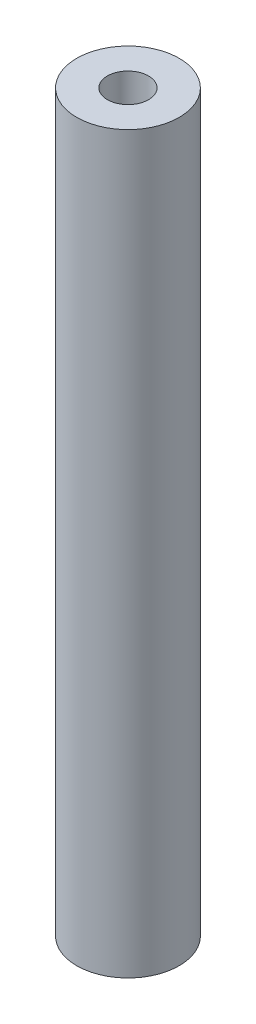
ISO-10303-21;
HEADER;
FILE_DESCRIPTION(('STEP AP214'),'2;1');
FILE_NAME('part.step','',(''),(''),'','','');
FILE_SCHEMA(('AUTOMOTIVE_DESIGN { 1 0 10303 214 1 1 1 1 }'));
ENDSEC;
DATA;
#1=APPLICATION_CONTEXT('core data for automotive mechanical design processes');
#2=APPLICATION_PROTOCOL_DEFINITION('international standard','automotive_design',2000,#1);
#3=PRODUCT_CONTEXT('',#1,'mechanical');
#4=PRODUCT('Part','Part','',(#3));
#5=PRODUCT_RELATED_PRODUCT_CATEGORY('part','',(#4));
#6=PRODUCT_DEFINITION_FORMATION('','',#4);
#7=PRODUCT_DEFINITION_CONTEXT('part definition',#1,'design');
#8=PRODUCT_DEFINITION('design','',#6,#7);
#9=PRODUCT_DEFINITION_SHAPE('','',#8);
#10=(LENGTH_UNIT() NAMED_UNIT(*) SI_UNIT(.MILLI.,.METRE.));
#11=(NAMED_UNIT(*) PLANE_ANGLE_UNIT() SI_UNIT($,.RADIAN.));
#12=(NAMED_UNIT(*) SI_UNIT($,.STERADIAN.) SOLID_ANGLE_UNIT());
#13=UNCERTAINTY_MEASURE_WITH_UNIT(LENGTH_MEASURE(1.E-05),#10,'distance_accuracy_value','');
#14=(GEOMETRIC_REPRESENTATION_CONTEXT(3) GLOBAL_UNCERTAINTY_ASSIGNED_CONTEXT((#13)) GLOBAL_UNIT_ASSIGNED_CONTEXT((#10,
#11,#12)) REPRESENTATION_CONTEXT('',''));
#15=CARTESIAN_POINT('',(0.,0.,0.));
#16=DIRECTION('',(0.,0.,1.));
#17=DIRECTION('',(1.,0.,0.));
#18=AXIS2_PLACEMENT_3D('',#15,#16,#17);
#19=CARTESIAN_POINT('',(0.,91.0844,0.));
#20=DIRECTION('',(0.,-1.,0.));
#21=DIRECTION('',(0.,0.,-1.));
#22=AXIS2_PLACEMENT_3D('',#19,#20,#21);
#23=CYLINDRICAL_SURFACE('',#22,6.35);
#24=CARTESIAN_POINT('',(0.,91.0844,0.));
#25=DIRECTION('',(0.,1.,0.));
#26=DIRECTION('',(0.,0.,1.));
#27=AXIS2_PLACEMENT_3D('',#24,#25,#26);
#28=CIRCLE('',#27,6.35);
#29=CARTESIAN_POINT('',(0.,91.0844,6.35));
#30=VERTEX_POINT('',#29);
#31=EDGE_CURVE('E11',#30,#30,#28,.T.);
#32=ORIENTED_EDGE('',*,*,#31,.F.);
#33=EDGE_LOOP('',(#32));
#34=FACE_BOUND('',#33,.T.);
#35=CARTESIAN_POINT('',(0.,0.,0.));
#36=DIRECTION('',(0.,1.,0.));
#37=DIRECTION('',(0.,0.,1.));
#38=AXIS2_PLACEMENT_3D('',#35,#36,#37);
#39=CIRCLE('',#38,6.35);
#40=CARTESIAN_POINT('',(0.,0.,6.35));
#41=VERTEX_POINT('',#40);
#42=EDGE_CURVE('E50',#41,#41,#39,.T.);
#43=ORIENTED_EDGE('',*,*,#42,.T.);
#44=EDGE_LOOP('',(#43));
#45=FACE_BOUND('',#44,.T.);
#46=ADVANCED_FACE('F47',(#34,#45),#23,.T.);
#47=CARTESIAN_POINT('',(0.,91.0844,0.));
#48=DIRECTION('',(0.,1.,0.));
#49=DIRECTION('',(0.,0.,1.));
#50=AXIS2_PLACEMENT_3D('',#47,#48,#49);
#51=PLANE('',#50);
#52=CARTESIAN_POINT('',(0.,91.0844,0.));
#53=DIRECTION('',(0.,1.,0.));
#54=DIRECTION('',(0.,0.,1.));
#55=AXIS2_PLACEMENT_3D('',#52,#53,#54);
#56=CIRCLE('',#55,2.55269999999999);
#57=CARTESIAN_POINT('',(0.,91.0844,2.55269999999999));
#58=VERTEX_POINT('',#57);
#59=EDGE_CURVE('E72',#58,#58,#56,.T.);
#60=ORIENTED_EDGE('',*,*,#59,.F.);
#61=EDGE_LOOP('',(#60));
#62=FACE_BOUND('',#61,.T.);
#63=ORIENTED_EDGE('',*,*,#31,.T.);
#64=EDGE_LOOP('',(#63));
#65=FACE_BOUND('',#64,.T.);
#66=ADVANCED_FACE('F95',(#62,#65),#51,.T.);
#67=CARTESIAN_POINT('',(0.,0.,0.));
#68=DIRECTION('',(0.,1.,0.));
#69=DIRECTION('',(0.,0.,1.));
#70=AXIS2_PLACEMENT_3D('',#67,#68,#69);
#71=PLANE('',#70);
#72=CARTESIAN_POINT('',(0.,0.,0.));
#73=DIRECTION('',(0.,-1.,0.));
#74=DIRECTION('',(0.,0.,-1.));
#75=AXIS2_PLACEMENT_3D('',#72,#73,#74);
#76=CIRCLE('',#75,2.55269999999999);
#77=CARTESIAN_POINT('',(0.,0.,-2.55269999999999));
#78=VERTEX_POINT('',#77);
#79=EDGE_CURVE('E73',#78,#78,#76,.T.);
#80=ORIENTED_EDGE('',*,*,#79,.F.);
#81=EDGE_LOOP('',(#80));
#82=FACE_BOUND('',#81,.T.);
#83=ORIENTED_EDGE('',*,*,#42,.F.);
#84=EDGE_LOOP('',(#83));
#85=FACE_BOUND('',#84,.T.);
#86=ADVANCED_FACE('F92',(#82,#85),#71,.F.);
#87=CARTESIAN_POINT('',(0.,65.6844,0.));
#88=DIRECTION('',(0.,1.,0.));
#89=DIRECTION('',(0.,0.,1.));
#90=AXIS2_PLACEMENT_3D('',#87,#88,#89);
#91=CONICAL_SURFACE('',#90,2.55269999999999,1.02974425867665);
#92=CARTESIAN_POINT('',(0.,64.1505830978083,0.));
#93=VERTEX_POINT('',#92);
#94=VERTEX_LOOP('',#93);
#95=FACE_BOUND('',#94,.T.);
#96=CARTESIAN_POINT('',(0.,65.6844,0.));
#97=DIRECTION('',(0.,1.,0.));
#98=DIRECTION('',(0.,0.,1.));
#99=AXIS2_PLACEMENT_3D('',#96,#97,#98);
#100=CIRCLE('',#99,2.55269999999999);
#101=CARTESIAN_POINT('',(0.,65.6844,2.55269999999999));
#102=VERTEX_POINT('',#101);
#103=EDGE_CURVE('E78',#102,#102,#100,.T.);
#104=ORIENTED_EDGE('',*,*,#103,.T.);
#105=EDGE_LOOP('',(#104));
#106=FACE_BOUND('',#105,.T.);
#107=ADVANCED_FACE('F94',(#95,#106),#91,.F.);
#108=CARTESIAN_POINT('',(0.,91.0844,0.));
#109=DIRECTION('',(0.,1.,0.));
#110=DIRECTION('',(0.,0.,1.));
#111=AXIS2_PLACEMENT_3D('',#108,#109,#110);
#112=CYLINDRICAL_SURFACE('',#111,2.55269999999999);
#113=ORIENTED_EDGE('',*,*,#103,.F.);
#114=EDGE_LOOP('',(#113));
#115=FACE_BOUND('',#114,.T.);
#116=ORIENTED_EDGE('',*,*,#59,.T.);
#117=EDGE_LOOP('',(#116));
#118=FACE_BOUND('',#117,.T.);
#119=ADVANCED_FACE('F65',(#115,#118),#112,.F.);
#120=CARTESIAN_POINT('',(0.,25.4,0.));
#121=DIRECTION('',(0.,-1.,0.));
#122=DIRECTION('',(0.,0.,-1.));
#123=AXIS2_PLACEMENT_3D('',#120,#121,#122);
#124=CONICAL_SURFACE('',#123,2.55269999999999,1.02974425867665);
#125=CARTESIAN_POINT('',(0.,26.9338169021917,0.));
#126=VERTEX_POINT('',#125);
#127=VERTEX_LOOP('',#126);
#128=FACE_BOUND('',#127,.T.);
#129=CARTESIAN_POINT('',(0.,25.4,0.));
#130=DIRECTION('',(0.,-1.,0.));
#131=DIRECTION('',(0.,0.,-1.));
#132=AXIS2_PLACEMENT_3D('',#129,#130,#131);
#133=CIRCLE('',#132,2.55269999999999);
#134=CARTESIAN_POINT('',(0.,25.4,-2.55269999999999));
#135=VERTEX_POINT('',#134);
#136=EDGE_CURVE('E69',#135,#135,#133,.T.);
#137=ORIENTED_EDGE('',*,*,#136,.T.);
#138=EDGE_LOOP('',(#137));
#139=FACE_BOUND('',#138,.T.);
#140=ADVANCED_FACE('F61',(#128,#139),#124,.F.);
#141=CARTESIAN_POINT('',(0.,0.,0.));
#142=DIRECTION('',(0.,-1.,0.));
#143=DIRECTION('',(0.,0.,-1.));
#144=AXIS2_PLACEMENT_3D('',#141,#142,#143);
#145=CYLINDRICAL_SURFACE('',#144,2.55269999999999);
#146=ORIENTED_EDGE('',*,*,#136,.F.);
#147=EDGE_LOOP('',(#146));
#148=FACE_BOUND('',#147,.T.);
#149=ORIENTED_EDGE('',*,*,#79,.T.);
#150=EDGE_LOOP('',(#149));
#151=FACE_BOUND('',#150,.T.);
#152=ADVANCED_FACE('F64',(#148,#151),#145,.F.);
#153=CLOSED_SHELL('',(#46,#66,#86,#107,#119,#140,#152));
#154=MANIFOLD_SOLID_BREP('B2',#153);
#155=ADVANCED_BREP_SHAPE_REPRESENTATION('',(#18,#154),#14);
#156=SHAPE_DEFINITION_REPRESENTATION(#9,#155);
ENDSEC;
END-ISO-10303-21;
